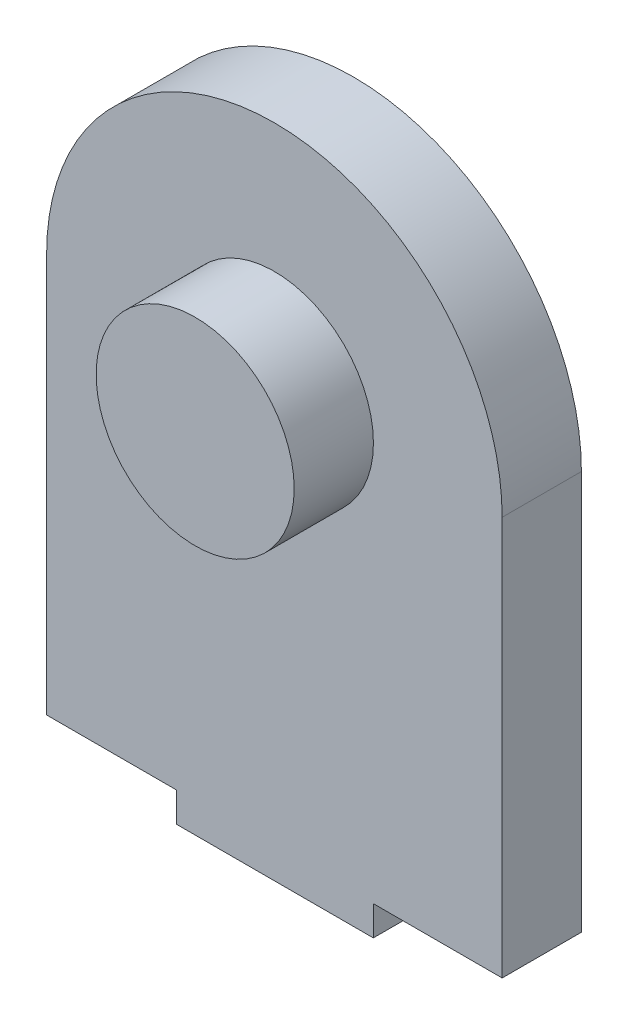
ISO-10303-21;
HEADER;
FILE_DESCRIPTION(('STEP AP214'),'2;1');
FILE_NAME('part.step','',(''),(''),'','','');
FILE_SCHEMA(('AUTOMOTIVE_DESIGN { 1 0 10303 214 1 1 1 1 }'));
ENDSEC;
DATA;
#1=APPLICATION_CONTEXT('core data for automotive mechanical design processes');
#2=APPLICATION_PROTOCOL_DEFINITION('international standard','automotive_design',2000,#1);
#3=PRODUCT_CONTEXT('',#1,'mechanical');
#4=PRODUCT('Part','Part','',(#3));
#5=PRODUCT_RELATED_PRODUCT_CATEGORY('part','',(#4));
#6=PRODUCT_DEFINITION_FORMATION('','',#4);
#7=PRODUCT_DEFINITION_CONTEXT('part definition',#1,'design');
#8=PRODUCT_DEFINITION('design','',#6,#7);
#9=PRODUCT_DEFINITION_SHAPE('','',#8);
#10=(LENGTH_UNIT() NAMED_UNIT(*) SI_UNIT(.MILLI.,.METRE.));
#11=(NAMED_UNIT(*) PLANE_ANGLE_UNIT() SI_UNIT($,.RADIAN.));
#12=(NAMED_UNIT(*) SI_UNIT($,.STERADIAN.) SOLID_ANGLE_UNIT());
#13=UNCERTAINTY_MEASURE_WITH_UNIT(LENGTH_MEASURE(1.E-05),#10,'distance_accuracy_value','');
#14=(GEOMETRIC_REPRESENTATION_CONTEXT(3) GLOBAL_UNCERTAINTY_ASSIGNED_CONTEXT((#13)) GLOBAL_UNIT_ASSIGNED_CONTEXT((#10,
#11,#12)) REPRESENTATION_CONTEXT('',''));
#15=CARTESIAN_POINT('',(0.,0.,0.));
#16=DIRECTION('',(0.,0.,1.));
#17=DIRECTION('',(1.,0.,0.));
#18=AXIS2_PLACEMENT_3D('',#15,#16,#17);
#19=CARTESIAN_POINT('',(0.,-40.29,8.));
#20=DIRECTION('',(0.,1.,0.));
#21=DIRECTION('',(0.,0.,1.));
#22=AXIS2_PLACEMENT_3D('',#19,#20,#21);
#23=PLANE('',#22);
#24=CARTESIAN_POINT('',(19.,-40.29,4.));
#25=DIRECTION('',(0.,1.,0.));
#26=DIRECTION('',(0.,0.,-1.));
#27=AXIS2_PLACEMENT_3D('',#24,#25,#26);
#28=CIRCLE('',#27,1.8);
#29=CARTESIAN_POINT('',(19.,-40.29,2.2));
#30=VERTEX_POINT('',#29);
#31=EDGE_CURVE('E201',#30,#30,#28,.T.);
#32=ORIENTED_EDGE('',*,*,#31,.T.);
#33=EDGE_LOOP('',(#32));
#34=FACE_BOUND('',#33,.T.);
#35=DIRECTION('',(0.,0.,1.));
#36=VECTOR('',#35,1.);
#37=CARTESIAN_POINT('',(9.9911878645589,-40.29,0.));
#38=LINE('',#37,#36);
#39=CARTESIAN_POINT('',(9.9911878645589,-40.29,0.));
#40=VERTEX_POINT('',#39);
#41=CARTESIAN_POINT('',(9.9911878645589,-40.29,8.));
#42=VERTEX_POINT('',#41);
#43=EDGE_CURVE('E134',#40,#42,#38,.T.);
#44=ORIENTED_EDGE('',*,*,#43,.F.);
#45=DIRECTION('',(1.,0.,0.));
#46=VECTOR('',#45,1.);
#47=CARTESIAN_POINT('',(0.,-40.29,0.));
#48=LINE('',#47,#46);
#49=CARTESIAN_POINT('',(23.,-40.29,0.));
#50=VERTEX_POINT('',#49);
#51=EDGE_CURVE('E160',#40,#50,#48,.T.);
#52=ORIENTED_EDGE('',*,*,#51,.T.);
#53=DIRECTION('',(0.,0.,-1.));
#54=VECTOR('',#53,1.);
#55=CARTESIAN_POINT('',(23.,-40.29,8.));
#56=LINE('',#55,#54);
#57=CARTESIAN_POINT('',(23.,-40.29,8.));
#58=VERTEX_POINT('',#57);
#59=EDGE_CURVE('E166',#58,#50,#56,.T.);
#60=ORIENTED_EDGE('',*,*,#59,.F.);
#61=DIRECTION('',(1.,0.,0.));
#62=VECTOR('',#61,1.);
#63=CARTESIAN_POINT('',(0.,-40.29,8.));
#64=LINE('',#63,#62);
#65=EDGE_CURVE('E62',#42,#58,#64,.T.);
#66=ORIENTED_EDGE('',*,*,#65,.F.);
#67=EDGE_LOOP('',(#44,#52,#60,#66));
#68=FACE_BOUND('',#67,.T.);
#69=ADVANCED_FACE('F46',(#34,#68),#23,.F.);
#70=CARTESIAN_POINT('',(-19.,-40.29,4.));
#71=DIRECTION('',(0.,-1.,0.));
#72=DIRECTION('',(0.,0.,-1.));
#73=AXIS2_PLACEMENT_3D('',#70,#71,#72);
#74=CIRCLE('',#73,1.8);
#75=CARTESIAN_POINT('',(-19.,-40.29,2.2));
#76=VERTEX_POINT('',#75);
#77=EDGE_CURVE('E195',#76,#76,#74,.T.);
#78=ORIENTED_EDGE('',*,*,#77,.F.);
#79=EDGE_LOOP('',(#78));
#80=FACE_BOUND('',#79,.T.);
#81=DIRECTION('',(0.,0.,-1.));
#82=VECTOR('',#81,1.);
#83=CARTESIAN_POINT('',(-9.85925137632498,-40.29,0.));
#84=LINE('',#83,#82);
#85=CARTESIAN_POINT('',(-9.85925137632498,-40.29,8.));
#86=VERTEX_POINT('',#85);
#87=CARTESIAN_POINT('',(-9.85925137632498,-40.29,0.));
#88=VERTEX_POINT('',#87);
#89=EDGE_CURVE('E70',#86,#88,#84,.T.);
#90=ORIENTED_EDGE('',*,*,#89,.F.);
#91=CARTESIAN_POINT('',(-23.,-40.29,8.));
#92=VERTEX_POINT('',#91);
#93=EDGE_CURVE('E150',#92,#86,#64,.T.);
#94=ORIENTED_EDGE('',*,*,#93,.F.);
#95=DIRECTION('',(0.,0.,-1.));
#96=VECTOR('',#95,1.);
#97=CARTESIAN_POINT('',(-23.,-40.29,8.));
#98=LINE('',#97,#96);
#99=CARTESIAN_POINT('',(-23.,-40.29,0.));
#100=VERTEX_POINT('',#99);
#101=EDGE_CURVE('E168',#92,#100,#98,.T.);
#102=ORIENTED_EDGE('',*,*,#101,.T.);
#103=EDGE_CURVE('E161',#100,#88,#48,.T.);
#104=ORIENTED_EDGE('',*,*,#103,.T.);
#105=EDGE_LOOP('',(#90,#94,#102,#104));
#106=FACE_BOUND('',#105,.T.);
#107=ADVANCED_FACE('F184',(#80,#106),#23,.F.);
#108=CARTESIAN_POINT('',(0.,0.,8.));
#109=DIRECTION('',(0.,0.,-1.));
#110=DIRECTION('',(-1.,0.,0.));
#111=AXIS2_PLACEMENT_3D('',#108,#109,#110);
#112=CYLINDRICAL_SURFACE('',#111,23.);
#113=CARTESIAN_POINT('',(0.,0.,0.));
#114=DIRECTION('',(0.,0.,1.));
#115=DIRECTION('',(1.,0.,0.));
#116=AXIS2_PLACEMENT_3D('',#113,#114,#115);
#117=CIRCLE('',#116,23.);
#118=CARTESIAN_POINT('',(23.,0.,0.));
#119=VERTEX_POINT('',#118);
#120=CARTESIAN_POINT('',(-23.,0.,0.));
#121=VERTEX_POINT('',#120);
#122=EDGE_CURVE('E138',#119,#121,#117,.T.);
#123=ORIENTED_EDGE('',*,*,#122,.T.);
#124=DIRECTION('',(0.,0.,-1.));
#125=VECTOR('',#124,1.);
#126=CARTESIAN_POINT('',(-23.,0.,8.));
#127=LINE('',#126,#125);
#128=CARTESIAN_POINT('',(-23.,0.,8.));
#129=VERTEX_POINT('',#128);
#130=EDGE_CURVE('E50',#129,#121,#127,.T.);
#131=ORIENTED_EDGE('',*,*,#130,.F.);
#132=CARTESIAN_POINT('',(0.,0.,8.));
#133=DIRECTION('',(0.,0.,1.));
#134=DIRECTION('',(1.,0.,0.));
#135=AXIS2_PLACEMENT_3D('',#132,#133,#134);
#136=CIRCLE('',#135,23.);
#137=CARTESIAN_POINT('',(23.,0.,8.));
#138=VERTEX_POINT('',#137);
#139=EDGE_CURVE('E144',#138,#129,#136,.T.);
#140=ORIENTED_EDGE('',*,*,#139,.F.);
#141=DIRECTION('',(0.,0.,-1.));
#142=VECTOR('',#141,1.);
#143=CARTESIAN_POINT('',(23.,0.,8.));
#144=LINE('',#143,#142);
#145=EDGE_CURVE('E154',#138,#119,#144,.T.);
#146=ORIENTED_EDGE('',*,*,#145,.T.);
#147=EDGE_LOOP('',(#123,#131,#140,#146));
#148=FACE_BOUND('',#147,.T.);
#149=ADVANCED_FACE('F48',(#148),#112,.T.);
#150=CARTESIAN_POINT('',(-23.,0.,8.));
#151=DIRECTION('',(-1.,0.,0.));
#152=DIRECTION('',(0.,0.,1.));
#153=AXIS2_PLACEMENT_3D('',#150,#151,#152);
#154=PLANE('',#153);
#155=DIRECTION('',(0.,1.,0.));
#156=VECTOR('',#155,1.);
#157=CARTESIAN_POINT('',(-23.,0.,0.));
#158=LINE('',#157,#156);
#159=EDGE_CURVE('E157',#100,#121,#158,.T.);
#160=ORIENTED_EDGE('',*,*,#159,.F.);
#161=ORIENTED_EDGE('',*,*,#101,.F.);
#162=DIRECTION('',(0.,1.,0.));
#163=VECTOR('',#162,1.);
#164=CARTESIAN_POINT('',(-23.,0.,8.));
#165=LINE('',#164,#163);
#166=EDGE_CURVE('E146',#92,#129,#165,.T.);
#167=ORIENTED_EDGE('',*,*,#166,.T.);
#168=ORIENTED_EDGE('',*,*,#130,.T.);
#169=EDGE_LOOP('',(#160,#161,#167,#168));
#170=FACE_BOUND('',#169,.T.);
#171=ADVANCED_FACE('F173',(#170),#154,.T.);
#172=CARTESIAN_POINT('',(23.,0.,8.));
#173=DIRECTION('',(-1.,0.,0.));
#174=DIRECTION('',(0.,0.,1.));
#175=AXIS2_PLACEMENT_3D('',#172,#173,#174);
#176=PLANE('',#175);
#177=DIRECTION('',(0.,1.,0.));
#178=VECTOR('',#177,1.);
#179=CARTESIAN_POINT('',(23.,0.,0.));
#180=LINE('',#179,#178);
#181=EDGE_CURVE('E147',#50,#119,#180,.T.);
#182=ORIENTED_EDGE('',*,*,#181,.T.);
#183=ORIENTED_EDGE('',*,*,#145,.F.);
#184=DIRECTION('',(0.,1.,0.));
#185=VECTOR('',#184,1.);
#186=CARTESIAN_POINT('',(23.,0.,8.));
#187=LINE('',#186,#185);
#188=EDGE_CURVE('E152',#58,#138,#187,.T.);
#189=ORIENTED_EDGE('',*,*,#188,.F.);
#190=ORIENTED_EDGE('',*,*,#59,.T.);
#191=EDGE_LOOP('',(#182,#183,#189,#190));
#192=FACE_BOUND('',#191,.T.);
#193=ADVANCED_FACE('F226',(#192),#176,.F.);
#194=CARTESIAN_POINT('',(0.,0.,8.));
#195=DIRECTION('',(0.,0.,1.));
#196=DIRECTION('',(1.,0.,0.));
#197=AXIS2_PLACEMENT_3D('',#194,#195,#196);
#198=PLANE('',#197);
#199=CARTESIAN_POINT('',(0.,0.,8.));
#200=DIRECTION('',(0.,0.,1.));
#201=DIRECTION('',(1.,0.,0.));
#202=AXIS2_PLACEMENT_3D('',#199,#200,#201);
#203=CIRCLE('',#202,10.);
#204=CARTESIAN_POINT('',(10.,0.,8.));
#205=VERTEX_POINT('',#204);
#206=EDGE_CURVE('E11',#205,#205,#203,.T.);
#207=ORIENTED_EDGE('',*,*,#206,.F.);
#208=EDGE_LOOP('',(#207));
#209=FACE_BOUND('',#208,.T.);
#210=ORIENTED_EDGE('',*,*,#139,.T.);
#211=ORIENTED_EDGE('',*,*,#166,.F.);
#212=ORIENTED_EDGE('',*,*,#93,.T.);
#213=DIRECTION('',(0.,1.,0.));
#214=VECTOR('',#213,1.);
#215=CARTESIAN_POINT('',(-9.85925137632498,-43.29,8.));
#216=LINE('',#215,#214);
#217=CARTESIAN_POINT('',(-9.85925137632498,-43.29,8.));
#218=VERTEX_POINT('',#217);
#219=EDGE_CURVE('E119',#218,#86,#216,.T.);
#220=ORIENTED_EDGE('',*,*,#219,.F.);
#221=DIRECTION('',(-1.,0.,0.));
#222=VECTOR('',#221,1.);
#223=CARTESIAN_POINT('',(-9.85925137632498,-43.29,8.));
#224=LINE('',#223,#222);
#225=CARTESIAN_POINT('',(9.9911878645589,-43.29,8.));
#226=VERTEX_POINT('',#225);
#227=EDGE_CURVE('E112',#226,#218,#224,.T.);
#228=ORIENTED_EDGE('',*,*,#227,.F.);
#229=DIRECTION('',(0.,1.,0.));
#230=VECTOR('',#229,1.);
#231=CARTESIAN_POINT('',(9.9911878645589,-43.29,8.));
#232=LINE('',#231,#230);
#233=EDGE_CURVE('E116',#226,#42,#232,.T.);
#234=ORIENTED_EDGE('',*,*,#233,.T.);
#235=ORIENTED_EDGE('',*,*,#65,.T.);
#236=ORIENTED_EDGE('',*,*,#188,.T.);
#237=EDGE_LOOP('',(#210,#211,#212,#220,#228,#234,#235,#236));
#238=FACE_BOUND('',#237,.T.);
#239=ADVANCED_FACE('F114',(#209,#238),#198,.T.);
#240=CARTESIAN_POINT('',(0.,0.,0.));
#241=DIRECTION('',(0.,0.,1.));
#242=DIRECTION('',(1.,0.,0.));
#243=AXIS2_PLACEMENT_3D('',#240,#241,#242);
#244=PLANE('',#243);
#245=ORIENTED_EDGE('',*,*,#122,.F.);
#246=ORIENTED_EDGE('',*,*,#181,.F.);
#247=ORIENTED_EDGE('',*,*,#51,.F.);
#248=DIRECTION('',(0.,1.,0.));
#249=VECTOR('',#248,1.);
#250=CARTESIAN_POINT('',(9.9911878645589,-43.29,0.));
#251=LINE('',#250,#249);
#252=CARTESIAN_POINT('',(9.9911878645589,-43.29,0.));
#253=VERTEX_POINT('',#252);
#254=EDGE_CURVE('E192',#253,#40,#251,.T.);
#255=ORIENTED_EDGE('',*,*,#254,.F.);
#256=DIRECTION('',(1.,0.,0.));
#257=VECTOR('',#256,1.);
#258=CARTESIAN_POINT('',(-9.85925137632498,-43.29,0.));
#259=LINE('',#258,#257);
#260=CARTESIAN_POINT('',(-9.85925137632498,-43.29,0.));
#261=VERTEX_POINT('',#260);
#262=EDGE_CURVE('E128',#261,#253,#259,.T.);
#263=ORIENTED_EDGE('',*,*,#262,.F.);
#264=DIRECTION('',(0.,1.,0.));
#265=VECTOR('',#264,1.);
#266=CARTESIAN_POINT('',(-9.85925137632498,-43.29,0.));
#267=LINE('',#266,#265);
#268=EDGE_CURVE('E140',#261,#88,#267,.T.);
#269=ORIENTED_EDGE('',*,*,#268,.T.);
#270=ORIENTED_EDGE('',*,*,#103,.F.);
#271=ORIENTED_EDGE('',*,*,#159,.T.);
#272=EDGE_LOOP('',(#245,#246,#247,#255,#263,#269,#270,#271));
#273=FACE_BOUND('',#272,.T.);
#274=ADVANCED_FACE('F181',(#273),#244,.F.);
#275=CARTESIAN_POINT('',(0.,0.,16.));
#276=DIRECTION('',(0.,0.,-1.));
#277=DIRECTION('',(-1.,0.,0.));
#278=AXIS2_PLACEMENT_3D('',#275,#276,#277);
#279=CYLINDRICAL_SURFACE('',#278,10.);
#280=CARTESIAN_POINT('',(0.,0.,16.));
#281=DIRECTION('',(0.,0.,1.));
#282=DIRECTION('',(1.,0.,0.));
#283=AXIS2_PLACEMENT_3D('',#280,#281,#282);
#284=CIRCLE('',#283,10.);
#285=CARTESIAN_POINT('',(10.,0.,16.));
#286=VERTEX_POINT('',#285);
#287=EDGE_CURVE('E135',#286,#286,#284,.T.);
#288=ORIENTED_EDGE('',*,*,#287,.F.);
#289=EDGE_LOOP('',(#288));
#290=FACE_BOUND('',#289,.T.);
#291=ORIENTED_EDGE('',*,*,#206,.T.);
#292=EDGE_LOOP('',(#291));
#293=FACE_BOUND('',#292,.T.);
#294=ADVANCED_FACE('F320',(#290,#293),#279,.T.);
#295=CARTESIAN_POINT('',(0.,0.,16.));
#296=DIRECTION('',(0.,0.,1.));
#297=DIRECTION('',(1.,0.,0.));
#298=AXIS2_PLACEMENT_3D('',#295,#296,#297);
#299=PLANE('',#298);
#300=ORIENTED_EDGE('',*,*,#287,.T.);
#301=EDGE_LOOP('',(#300));
#302=FACE_BOUND('',#301,.T.);
#303=ADVANCED_FACE('F307',(#302),#299,.T.);
#304=CARTESIAN_POINT('',(9.9911878645589,-43.29,0.));
#305=DIRECTION('',(-1.,0.,0.));
#306=DIRECTION('',(0.,0.,1.));
#307=AXIS2_PLACEMENT_3D('',#304,#305,#306);
#308=PLANE('',#307);
#309=ORIENTED_EDGE('',*,*,#43,.T.);
#310=ORIENTED_EDGE('',*,*,#233,.F.);
#311=DIRECTION('',(0.,0.,1.));
#312=VECTOR('',#311,1.);
#313=CARTESIAN_POINT('',(9.9911878645589,-43.29,0.));
#314=LINE('',#313,#312);
#315=EDGE_CURVE('E123',#253,#226,#314,.T.);
#316=ORIENTED_EDGE('',*,*,#315,.F.);
#317=ORIENTED_EDGE('',*,*,#254,.T.);
#318=EDGE_LOOP('',(#309,#310,#316,#317));
#319=FACE_BOUND('',#318,.T.);
#320=ADVANCED_FACE('F133',(#319),#308,.F.);
#321=CARTESIAN_POINT('',(-9.85925137632498,-43.29,0.));
#322=DIRECTION('',(1.,0.,0.));
#323=DIRECTION('',(0.,0.,-1.));
#324=AXIS2_PLACEMENT_3D('',#321,#322,#323);
#325=PLANE('',#324);
#326=ORIENTED_EDGE('',*,*,#89,.T.);
#327=ORIENTED_EDGE('',*,*,#268,.F.);
#328=DIRECTION('',(0.,0.,-1.));
#329=VECTOR('',#328,1.);
#330=CARTESIAN_POINT('',(-9.85925137632498,-43.29,0.));
#331=LINE('',#330,#329);
#332=EDGE_CURVE('E122',#218,#261,#331,.T.);
#333=ORIENTED_EDGE('',*,*,#332,.F.);
#334=ORIENTED_EDGE('',*,*,#219,.T.);
#335=EDGE_LOOP('',(#326,#327,#333,#334));
#336=FACE_BOUND('',#335,.T.);
#337=ADVANCED_FACE('F186',(#336),#325,.F.);
#338=CARTESIAN_POINT('',(0.,-43.29,0.));
#339=DIRECTION('',(0.,1.,0.));
#340=DIRECTION('',(0.,0.,1.));
#341=AXIS2_PLACEMENT_3D('',#338,#339,#340);
#342=PLANE('',#341);
#343=ORIENTED_EDGE('',*,*,#315,.T.);
#344=ORIENTED_EDGE('',*,*,#227,.T.);
#345=ORIENTED_EDGE('',*,*,#332,.T.);
#346=ORIENTED_EDGE('',*,*,#262,.T.);
#347=EDGE_LOOP('',(#343,#344,#345,#346));
#348=FACE_BOUND('',#347,.T.);
#349=ADVANCED_FACE('F126',(#348),#342,.F.);
#350=CARTESIAN_POINT('',(-19.,-35.29,4.));
#351=DIRECTION('',(0.,-1.,0.));
#352=DIRECTION('',(0.,0.,-1.));
#353=AXIS2_PLACEMENT_3D('',#350,#351,#352);
#354=CYLINDRICAL_SURFACE('',#353,1.8);
#355=CARTESIAN_POINT('',(-19.,-35.29,4.));
#356=DIRECTION('',(0.,-1.,0.));
#357=DIRECTION('',(0.,0.,-1.));
#358=AXIS2_PLACEMENT_3D('',#355,#356,#357);
#359=CIRCLE('',#358,1.8);
#360=CARTESIAN_POINT('',(-19.,-35.29,2.2));
#361=VERTEX_POINT('',#360);
#362=EDGE_CURVE('E188',#361,#361,#359,.T.);
#363=ORIENTED_EDGE('',*,*,#362,.F.);
#364=EDGE_LOOP('',(#363));
#365=FACE_BOUND('',#364,.T.);
#366=ORIENTED_EDGE('',*,*,#77,.T.);
#367=EDGE_LOOP('',(#366));
#368=FACE_BOUND('',#367,.T.);
#369=ADVANCED_FACE('F252',(#365,#368),#354,.F.);
#370=CARTESIAN_POINT('',(-19.,-35.29,4.));
#371=DIRECTION('',(0.,-1.,0.));
#372=DIRECTION('',(0.,0.,-1.));
#373=AXIS2_PLACEMENT_3D('',#370,#371,#372);
#374=PLANE('',#373);
#375=ORIENTED_EDGE('',*,*,#362,.T.);
#376=EDGE_LOOP('',(#375));
#377=FACE_BOUND('',#376,.T.);
#378=ADVANCED_FACE('F216',(#377),#374,.T.);
#379=CARTESIAN_POINT('',(19.,-35.29,4.));
#380=DIRECTION('',(0.,-1.,0.));
#381=DIRECTION('',(0.,0.,-1.));
#382=AXIS2_PLACEMENT_3D('',#379,#380,#381);
#383=CYLINDRICAL_SURFACE('',#382,1.8);
#384=CARTESIAN_POINT('',(19.,-35.29,4.));
#385=DIRECTION('',(0.,1.,0.));
#386=DIRECTION('',(0.,0.,-1.));
#387=AXIS2_PLACEMENT_3D('',#384,#385,#386);
#388=CIRCLE('',#387,1.8);
#389=CARTESIAN_POINT('',(19.,-35.29,2.2));
#390=VERTEX_POINT('',#389);
#391=EDGE_CURVE('E198',#390,#390,#388,.T.);
#392=ORIENTED_EDGE('',*,*,#391,.T.);
#393=EDGE_LOOP('',(#392));
#394=FACE_BOUND('',#393,.T.);
#395=ORIENTED_EDGE('',*,*,#31,.F.);
#396=EDGE_LOOP('',(#395));
#397=FACE_BOUND('',#396,.T.);
#398=ADVANCED_FACE('F207',(#394,#397),#383,.F.);
#399=CARTESIAN_POINT('',(19.,-35.29,4.));
#400=DIRECTION('',(0.,-1.,0.));
#401=DIRECTION('',(0.,0.,-1.));
#402=AXIS2_PLACEMENT_3D('',#399,#400,#401);
#403=PLANE('',#402);
#404=ORIENTED_EDGE('',*,*,#391,.F.);
#405=EDGE_LOOP('',(#404));
#406=FACE_BOUND('',#405,.T.);
#407=ADVANCED_FACE('F210',(#406),#403,.T.);
#408=CLOSED_SHELL('',(#69,#107,#149,#171,#193,#239,#274,#294,#303,#320,#337,#349,#369,#378,#398,#407));
#409=MANIFOLD_SOLID_BREP('B2',#408);
#410=ADVANCED_BREP_SHAPE_REPRESENTATION('',(#18,#409),#14);
#411=SHAPE_DEFINITION_REPRESENTATION(#9,#410);
ENDSEC;
END-ISO-10303-21;
